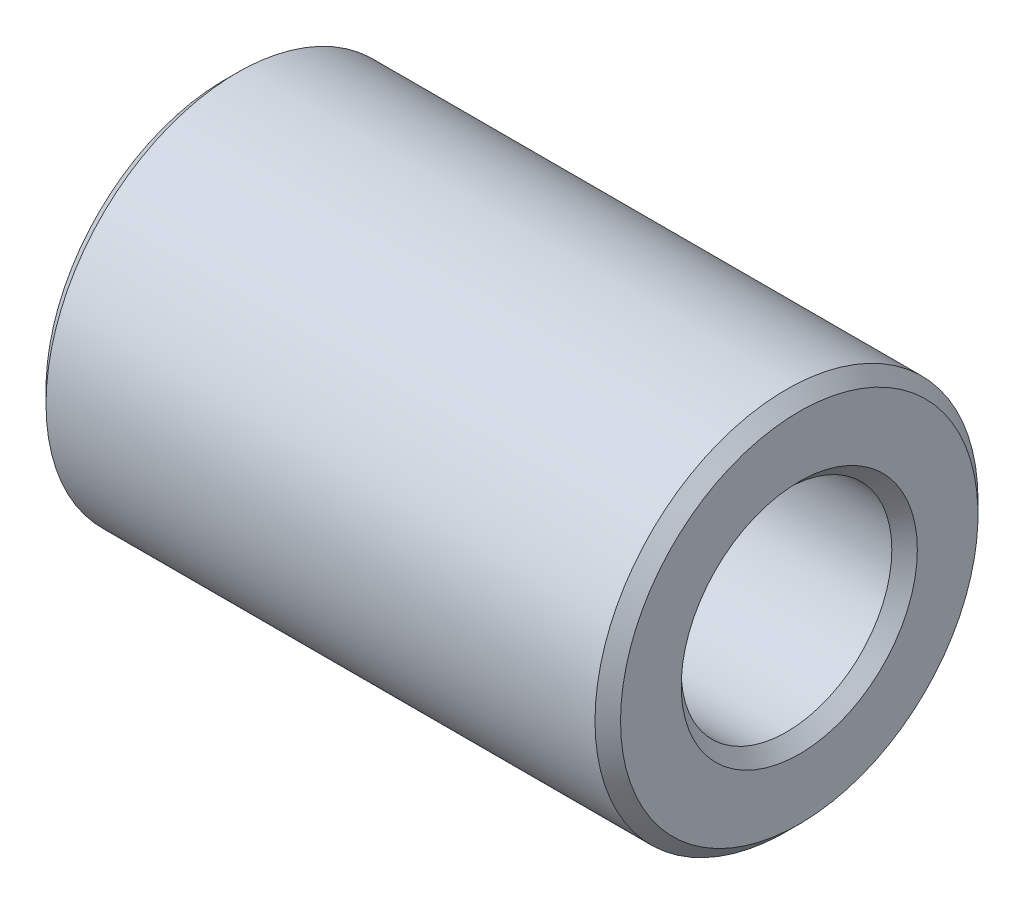
ISO-10303-21;
HEADER;
FILE_DESCRIPTION(('STEP AP214'),'2;1');
FILE_NAME('part.step','',(''),(''),'','','');
FILE_SCHEMA(('AUTOMOTIVE_DESIGN { 1 0 10303 214 1 1 1 1 }'));
ENDSEC;
DATA;
#1=APPLICATION_CONTEXT('core data for automotive mechanical design processes');
#2=APPLICATION_PROTOCOL_DEFINITION('international standard','automotive_design',2000,#1);
#3=PRODUCT_CONTEXT('',#1,'mechanical');
#4=PRODUCT('Part','Part','',(#3));
#5=PRODUCT_RELATED_PRODUCT_CATEGORY('part','',(#4));
#6=PRODUCT_DEFINITION_FORMATION('','',#4);
#7=PRODUCT_DEFINITION_CONTEXT('part definition',#1,'design');
#8=PRODUCT_DEFINITION('design','',#6,#7);
#9=PRODUCT_DEFINITION_SHAPE('','',#8);
#10=(LENGTH_UNIT() NAMED_UNIT(*) SI_UNIT(.MILLI.,.METRE.));
#11=(NAMED_UNIT(*) PLANE_ANGLE_UNIT() SI_UNIT($,.RADIAN.));
#12=(NAMED_UNIT(*) SI_UNIT($,.STERADIAN.) SOLID_ANGLE_UNIT());
#13=UNCERTAINTY_MEASURE_WITH_UNIT(LENGTH_MEASURE(1.E-05),#10,'distance_accuracy_value','');
#14=(GEOMETRIC_REPRESENTATION_CONTEXT(3) GLOBAL_UNCERTAINTY_ASSIGNED_CONTEXT((#13)) GLOBAL_UNIT_ASSIGNED_CONTEXT((#10,
#11,#12)) REPRESENTATION_CONTEXT('',''));
#15=CARTESIAN_POINT('',(0.,0.,0.));
#16=DIRECTION('',(0.,0.,1.));
#17=DIRECTION('',(1.,0.,0.));
#18=AXIS2_PLACEMENT_3D('',#15,#16,#17);
#19=CARTESIAN_POINT('',(22.5,0.,0.));
#20=DIRECTION('',(1.,0.,0.));
#21=DIRECTION('',(0.,0.,-1.));
#22=AXIS2_PLACEMENT_3D('',#19,#20,#21);
#23=CYLINDRICAL_SURFACE('',#22,8.25);
#24=CARTESIAN_POINT('',(44.0000000000013,0.,0.));
#25=DIRECTION('',(1.,0.,0.));
#26=DIRECTION('',(0.,-1.,0.));
#27=AXIS2_PLACEMENT_3D('',#24,#25,#26);
#28=CIRCLE('',#27,8.24999999999872);
#29=CARTESIAN_POINT('',(44.0000000000013,-8.24999999999872,0.));
#30=VERTEX_POINT('',#29);
#31=EDGE_CURVE('E34',#30,#30,#28,.T.);
#32=ORIENTED_EDGE('',*,*,#31,.T.);
#33=EDGE_LOOP('',(#32));
#34=FACE_BOUND('',#33,.T.);
#35=CARTESIAN_POINT('',(0.999999999998726,0.,0.));
#36=DIRECTION('',(-1.,0.,0.));
#37=DIRECTION('',(0.,-1.,0.));
#38=AXIS2_PLACEMENT_3D('',#35,#36,#37);
#39=CIRCLE('',#38,8.24999999999872);
#40=CARTESIAN_POINT('',(0.999999999998725,-8.24999999999872,0.));
#41=VERTEX_POINT('',#40);
#42=EDGE_CURVE('E37',#41,#41,#39,.T.);
#43=ORIENTED_EDGE('',*,*,#42,.T.);
#44=EDGE_LOOP('',(#43));
#45=FACE_BOUND('',#44,.T.);
#46=ADVANCED_FACE('F15',(#34,#45),#23,.F.);
#47=CARTESIAN_POINT('',(1.27469649419121E-12,0.,0.));
#48=DIRECTION('',(-1.,0.,0.));
#49=DIRECTION('',(0.,0.,1.));
#50=AXIS2_PLACEMENT_3D('',#47,#48,#49);
#51=CONICAL_SURFACE('',#50,9.25000000000128,0.785398163399998);
#52=CARTESIAN_POINT('',(1.27469649419121E-12,0.,0.));
#53=DIRECTION('',(-1.,0.,0.));
#54=DIRECTION('',(0.,0.,1.));
#55=AXIS2_PLACEMENT_3D('',#52,#53,#54);
#56=CIRCLE('',#55,9.25000000000128);
#57=CARTESIAN_POINT('',(1.27469649419121E-12,0.,9.25000000000128));
#58=VERTEX_POINT('',#57);
#59=EDGE_CURVE('E18',#58,#58,#56,.F.);
#60=ORIENTED_EDGE('',*,*,#59,.F.);
#61=EDGE_LOOP('',(#60));
#62=FACE_BOUND('',#61,.T.);
#63=ORIENTED_EDGE('',*,*,#42,.F.);
#64=EDGE_LOOP('',(#63));
#65=FACE_BOUND('',#64,.T.);
#66=ADVANCED_FACE('F58',(#62,#65),#51,.F.);
#67=CARTESIAN_POINT('',(44.9999999999987,0.,0.));
#68=DIRECTION('',(1.,0.,0.));
#69=DIRECTION('',(0.,0.,-1.));
#70=AXIS2_PLACEMENT_3D('',#67,#68,#69);
#71=CONICAL_SURFACE('',#70,9.25000000000128,0.785398163400001);
#72=ORIENTED_EDGE('',*,*,#31,.F.);
#73=EDGE_LOOP('',(#72));
#74=FACE_BOUND('',#73,.T.);
#75=CARTESIAN_POINT('',(44.9999999999987,0.,0.));
#76=DIRECTION('',(1.,0.,0.));
#77=DIRECTION('',(0.,0.,-1.));
#78=AXIS2_PLACEMENT_3D('',#75,#76,#77);
#79=CIRCLE('',#78,9.25000000000128);
#80=CARTESIAN_POINT('',(44.9999999999987,0.,-9.25000000000128));
#81=VERTEX_POINT('',#80);
#82=EDGE_CURVE('E48',#81,#81,#79,.F.);
#83=ORIENTED_EDGE('',*,*,#82,.F.);
#84=EDGE_LOOP('',(#83));
#85=FACE_BOUND('',#84,.T.);
#86=ADVANCED_FACE('F61',(#74,#85),#71,.F.);
#87=CARTESIAN_POINT('',(0.,15.,0.));
#88=DIRECTION('',(-1.,0.,0.));
#89=DIRECTION('',(0.,0.,1.));
#90=AXIS2_PLACEMENT_3D('',#87,#88,#89);
#91=PLANE('',#90);
#92=ORIENTED_EDGE('',*,*,#59,.T.);
#93=EDGE_LOOP('',(#92));
#94=FACE_BOUND('',#93,.T.);
#95=CARTESIAN_POINT('',(1.27437123353946E-12,0.,0.));
#96=DIRECTION('',(1.,0.,0.));
#97=DIRECTION('',(0.,0.,-1.));
#98=AXIS2_PLACEMENT_3D('',#95,#96,#97);
#99=CIRCLE('',#98,13.9999999999987);
#100=CARTESIAN_POINT('',(1.27437123353946E-12,0.,-13.9999999999987));
#101=VERTEX_POINT('',#100);
#102=EDGE_CURVE('E46',#101,#101,#99,.T.);
#103=ORIENTED_EDGE('',*,*,#102,.F.);
#104=EDGE_LOOP('',(#103));
#105=FACE_BOUND('',#104,.T.);
#106=ADVANCED_FACE('F55',(#94,#105),#91,.T.);
#107=CARTESIAN_POINT('',(45.,8.25000000000001,0.));
#108=DIRECTION('',(1.,0.,0.));
#109=DIRECTION('',(0.,0.,-1.));
#110=AXIS2_PLACEMENT_3D('',#107,#108,#109);
#111=PLANE('',#110);
#112=ORIENTED_EDGE('',*,*,#82,.T.);
#113=EDGE_LOOP('',(#112));
#114=FACE_BOUND('',#113,.T.);
#115=CARTESIAN_POINT('',(44.9999999999987,0.,0.));
#116=DIRECTION('',(-1.,0.,0.));
#117=DIRECTION('',(0.,0.,1.));
#118=AXIS2_PLACEMENT_3D('',#115,#116,#117);
#119=CIRCLE('',#118,13.9999999999987);
#120=CARTESIAN_POINT('',(44.9999999999987,0.,13.9999999999987));
#121=VERTEX_POINT('',#120);
#122=EDGE_CURVE('E27',#121,#121,#119,.T.);
#123=ORIENTED_EDGE('',*,*,#122,.F.);
#124=EDGE_LOOP('',(#123));
#125=FACE_BOUND('',#124,.T.);
#126=ADVANCED_FACE('F83',(#114,#125),#111,.T.);
#127=CARTESIAN_POINT('',(0.999999999998718,0.,0.));
#128=DIRECTION('',(1.,0.,0.));
#129=DIRECTION('',(0.,0.,-1.));
#130=AXIS2_PLACEMENT_3D('',#127,#128,#129);
#131=CONICAL_SURFACE('',#130,15.0000000000013,0.785398163400002);
#132=CARTESIAN_POINT('',(0.999999999999997,0.,0.));
#133=DIRECTION('',(1.,0.,0.));
#134=DIRECTION('',(0.,0.,-1.));
#135=AXIS2_PLACEMENT_3D('',#132,#133,#134);
#136=CIRCLE('',#135,15.);
#137=CARTESIAN_POINT('',(0.999999999999997,0.,-15.));
#138=VERTEX_POINT('',#137);
#139=EDGE_CURVE('E22',#138,#138,#136,.T.);
#140=ORIENTED_EDGE('',*,*,#139,.F.);
#141=EDGE_LOOP('',(#140));
#142=FACE_BOUND('',#141,.T.);
#143=ORIENTED_EDGE('',*,*,#102,.T.);
#144=EDGE_LOOP('',(#143));
#145=FACE_BOUND('',#144,.T.);
#146=ADVANCED_FACE('F76',(#142,#145),#131,.T.);
#147=CARTESIAN_POINT('',(44.0000000000013,0.,0.));
#148=DIRECTION('',(-1.,0.,0.));
#149=DIRECTION('',(0.,0.,1.));
#150=AXIS2_PLACEMENT_3D('',#147,#148,#149);
#151=CONICAL_SURFACE('',#150,15.0000000000013,0.785398163400002);
#152=ORIENTED_EDGE('',*,*,#122,.T.);
#153=EDGE_LOOP('',(#152));
#154=FACE_BOUND('',#153,.T.);
#155=CARTESIAN_POINT('',(44.,0.,0.));
#156=DIRECTION('',(1.,0.,0.));
#157=DIRECTION('',(0.,0.,-1.));
#158=AXIS2_PLACEMENT_3D('',#155,#156,#157);
#159=CIRCLE('',#158,15.);
#160=CARTESIAN_POINT('',(44.,0.,-15.));
#161=VERTEX_POINT('',#160);
#162=EDGE_CURVE('E10',#161,#161,#159,.F.);
#163=ORIENTED_EDGE('',*,*,#162,.F.);
#164=EDGE_LOOP('',(#163));
#165=FACE_BOUND('',#164,.T.);
#166=ADVANCED_FACE('F71',(#154,#165),#151,.T.);
#167=CARTESIAN_POINT('',(22.5,0.,0.));
#168=DIRECTION('',(1.,0.,0.));
#169=DIRECTION('',(0.,0.,-1.));
#170=AXIS2_PLACEMENT_3D('',#167,#168,#169);
#171=CYLINDRICAL_SURFACE('',#170,15.);
#172=ORIENTED_EDGE('',*,*,#162,.T.);
#173=EDGE_LOOP('',(#172));
#174=FACE_BOUND('',#173,.T.);
#175=ORIENTED_EDGE('',*,*,#139,.T.);
#176=EDGE_LOOP('',(#175));
#177=FACE_BOUND('',#176,.T.);
#178=ADVANCED_FACE('F69',(#174,#177),#171,.T.);
#179=CLOSED_SHELL('',(#46,#66,#86,#106,#126,#146,#166,#178));
#180=MANIFOLD_SOLID_BREP('B1',#179);
#181=ADVANCED_BREP_SHAPE_REPRESENTATION('',(#18,#180),#14);
#182=SHAPE_DEFINITION_REPRESENTATION(#9,#181);
ENDSEC;
END-ISO-10303-21;
